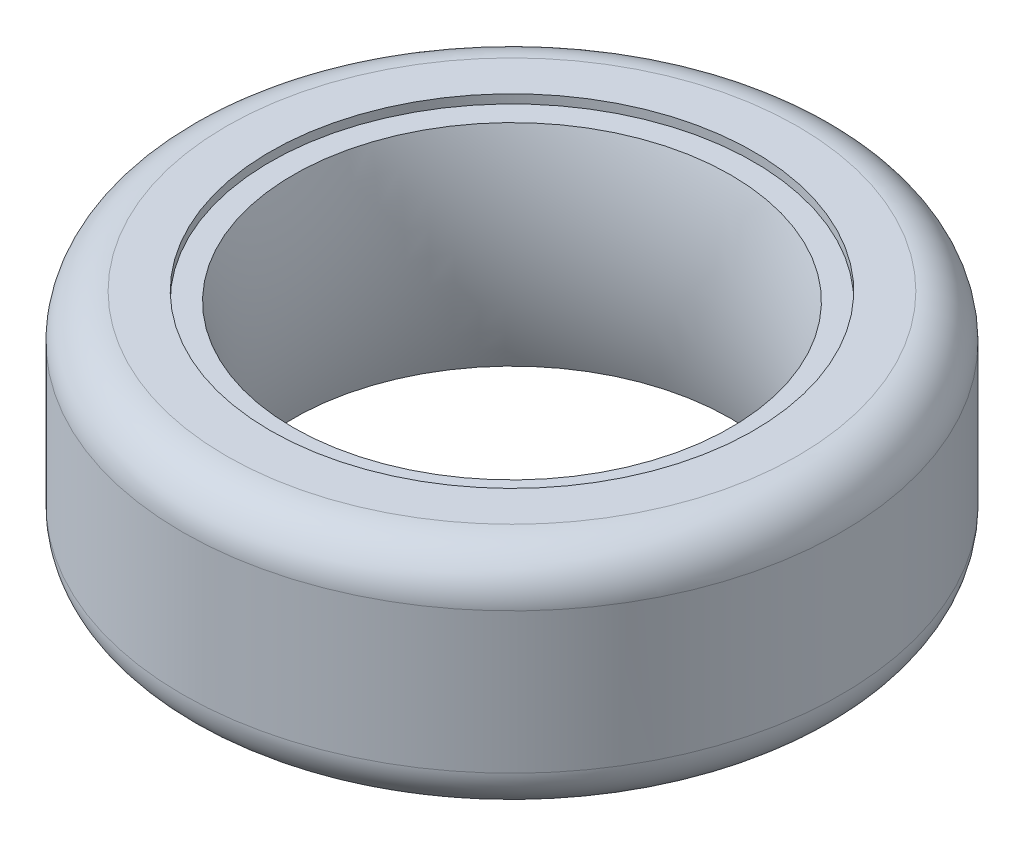
ISO-10303-21;
HEADER;
FILE_DESCRIPTION(('STEP AP214'),'2;1');
FILE_NAME('part.step','',(''),(''),'','','');
FILE_SCHEMA(('AUTOMOTIVE_DESIGN { 1 0 10303 214 1 1 1 1 }'));
ENDSEC;
DATA;
#1=APPLICATION_CONTEXT('core data for automotive mechanical design processes');
#2=APPLICATION_PROTOCOL_DEFINITION('international standard','automotive_design',2000,#1);
#3=PRODUCT_CONTEXT('',#1,'mechanical');
#4=PRODUCT('Part','Part','',(#3));
#5=PRODUCT_RELATED_PRODUCT_CATEGORY('part','',(#4));
#6=PRODUCT_DEFINITION_FORMATION('','',#4);
#7=PRODUCT_DEFINITION_CONTEXT('part definition',#1,'design');
#8=PRODUCT_DEFINITION('design','',#6,#7);
#9=PRODUCT_DEFINITION_SHAPE('','',#8);
#10=(LENGTH_UNIT() NAMED_UNIT(*) SI_UNIT(.MILLI.,.METRE.));
#11=(NAMED_UNIT(*) PLANE_ANGLE_UNIT() SI_UNIT($,.RADIAN.));
#12=(NAMED_UNIT(*) SI_UNIT($,.STERADIAN.) SOLID_ANGLE_UNIT());
#13=UNCERTAINTY_MEASURE_WITH_UNIT(LENGTH_MEASURE(1.E-05),#10,'distance_accuracy_value','');
#14=(GEOMETRIC_REPRESENTATION_CONTEXT(3) GLOBAL_UNCERTAINTY_ASSIGNED_CONTEXT((#13)) GLOBAL_UNIT_ASSIGNED_CONTEXT((#10,
#11,#12)) REPRESENTATION_CONTEXT('',''));
#15=CARTESIAN_POINT('',(0.,0.,0.));
#16=DIRECTION('',(0.,0.,1.));
#17=DIRECTION('',(1.,0.,0.));
#18=AXIS2_PLACEMENT_3D('',#15,#16,#17);
#19=CARTESIAN_POINT('',(0.,0.,0.));
#20=DIRECTION('',(0.,1.,0.));
#21=DIRECTION('',(0.,0.,1.));
#22=AXIS2_PLACEMENT_3D('',#19,#20,#21);
#23=TOROIDAL_SURFACE('',#22,63.0575680566778,40.);
#24=CARTESIAN_POINT('',(0.,-12.,0.));
#25=DIRECTION('',(0.,1.,0.));
#26=DIRECTION('',(0.,0.,1.));
#27=AXIS2_PLACEMENT_3D('',#24,#25,#26);
#28=CIRCLE('',#27,24.9);
#29=CARTESIAN_POINT('',(0.,-12.,24.9));
#30=VERTEX_POINT('',#29);
#31=EDGE_CURVE('E79',#30,#30,#28,.T.);
#32=ORIENTED_EDGE('',*,*,#31,.F.);
#33=EDGE_LOOP('',(#32));
#34=FACE_BOUND('',#33,.T.);
#35=CARTESIAN_POINT('',(0.,12.,0.));
#36=DIRECTION('',(0.,1.,0.));
#37=DIRECTION('',(0.,0.,1.));
#38=AXIS2_PLACEMENT_3D('',#35,#36,#37);
#39=CIRCLE('',#38,24.9);
#40=CARTESIAN_POINT('',(0.,12.,24.9));
#41=VERTEX_POINT('',#40);
#42=EDGE_CURVE('E64',#41,#41,#39,.T.);
#43=ORIENTED_EDGE('',*,*,#42,.T.);
#44=EDGE_LOOP('',(#43));
#45=FACE_BOUND('',#44,.T.);
#46=ADVANCED_FACE('F44',(#34,#45),#23,.T.);
#47=CARTESIAN_POINT('',(0.,12.,0.));
#48=DIRECTION('',(0.,-1.,0.));
#49=DIRECTION('',(0.,0.,-1.));
#50=AXIS2_PLACEMENT_3D('',#47,#48,#49);
#51=PLANE('',#50);
#52=ORIENTED_EDGE('',*,*,#42,.F.);
#53=EDGE_LOOP('',(#52));
#54=FACE_BOUND('',#53,.T.);
#55=CARTESIAN_POINT('',(0.,12.,0.));
#56=DIRECTION('',(0.,1.,0.));
#57=DIRECTION('',(0.,0.,1.));
#58=AXIS2_PLACEMENT_3D('',#55,#56,#57);
#59=CIRCLE('',#58,27.5);
#60=CARTESIAN_POINT('',(0.,12.,27.5));
#61=VERTEX_POINT('',#60);
#62=EDGE_CURVE('E67',#61,#61,#59,.T.);
#63=ORIENTED_EDGE('',*,*,#62,.T.);
#64=EDGE_LOOP('',(#63));
#65=FACE_BOUND('',#64,.T.);
#66=ADVANCED_FACE('F87',(#54,#65),#51,.F.);
#67=CARTESIAN_POINT('',(0.,39.1439042874109,0.));
#68=DIRECTION('',(0.,1.,0.));
#69=DIRECTION('',(0.,0.,1.));
#70=AXIS2_PLACEMENT_3D('',#67,#68,#69);
#71=CYLINDRICAL_SURFACE('',#70,27.5);
#72=CARTESIAN_POINT('',(0.,13.,0.));
#73=DIRECTION('',(0.,1.,0.));
#74=DIRECTION('',(0.,0.,1.));
#75=AXIS2_PLACEMENT_3D('',#72,#73,#74);
#76=CIRCLE('',#75,27.5);
#77=CARTESIAN_POINT('',(0.,13.,27.5));
#78=VERTEX_POINT('',#77);
#79=EDGE_CURVE('E70',#78,#78,#76,.T.);
#80=ORIENTED_EDGE('',*,*,#79,.T.);
#81=EDGE_LOOP('',(#80));
#82=FACE_BOUND('',#81,.T.);
#83=ORIENTED_EDGE('',*,*,#62,.F.);
#84=EDGE_LOOP('',(#83));
#85=FACE_BOUND('',#84,.T.);
#86=ADVANCED_FACE('F93',(#82,#85),#71,.F.);
#87=CARTESIAN_POINT('',(0.,13.,0.));
#88=DIRECTION('',(0.,1.,0.));
#89=DIRECTION('',(0.,0.,1.));
#90=AXIS2_PLACEMENT_3D('',#87,#88,#89);
#91=PLANE('',#90);
#92=CARTESIAN_POINT('',(0.,13.,0.));
#93=DIRECTION('',(0.,1.,0.));
#94=DIRECTION('',(0.,0.,1.));
#95=AXIS2_PLACEMENT_3D('',#92,#93,#94);
#96=CIRCLE('',#95,32.5);
#97=CARTESIAN_POINT('',(0.,13.,32.5));
#98=VERTEX_POINT('',#97);
#99=EDGE_CURVE('E59',#98,#98,#96,.T.);
#100=ORIENTED_EDGE('',*,*,#99,.T.);
#101=EDGE_LOOP('',(#100));
#102=FACE_BOUND('',#101,.T.);
#103=ORIENTED_EDGE('',*,*,#79,.F.);
#104=EDGE_LOOP('',(#103));
#105=FACE_BOUND('',#104,.T.);
#106=ADVANCED_FACE('F98',(#102,#105),#91,.T.);
#107=CARTESIAN_POINT('',(0.,39.1439042874109,0.));
#108=DIRECTION('',(0.,1.,0.));
#109=DIRECTION('',(0.,0.,1.));
#110=AXIS2_PLACEMENT_3D('',#107,#108,#109);
#111=CYLINDRICAL_SURFACE('',#110,37.5);
#112=CARTESIAN_POINT('',(0.,8.00000000000001,0.));
#113=DIRECTION('',(0.,1.,0.));
#114=DIRECTION('',(0.,0.,1.));
#115=AXIS2_PLACEMENT_3D('',#112,#113,#114);
#116=CIRCLE('',#115,37.5);
#117=CARTESIAN_POINT('',(0.,8.00000000000001,37.5));
#118=VERTEX_POINT('',#117);
#119=EDGE_CURVE('E51',#118,#118,#116,.F.);
#120=ORIENTED_EDGE('',*,*,#119,.T.);
#121=EDGE_LOOP('',(#120));
#122=FACE_BOUND('',#121,.T.);
#123=CARTESIAN_POINT('',(0.,-7.99999999999998,0.));
#124=DIRECTION('',(0.,-1.,0.));
#125=DIRECTION('',(0.,0.,-1.));
#126=AXIS2_PLACEMENT_3D('',#123,#124,#125);
#127=CIRCLE('',#126,37.5);
#128=CARTESIAN_POINT('',(0.,-7.99999999999998,-37.5));
#129=VERTEX_POINT('',#128);
#130=EDGE_CURVE('E55',#129,#129,#127,.F.);
#131=ORIENTED_EDGE('',*,*,#130,.T.);
#132=EDGE_LOOP('',(#131));
#133=FACE_BOUND('',#132,.T.);
#134=ADVANCED_FACE('F104',(#122,#133),#111,.T.);
#135=CARTESIAN_POINT('',(0.,-13.,0.));
#136=DIRECTION('',(0.,-1.,0.));
#137=DIRECTION('',(0.,0.,-1.));
#138=AXIS2_PLACEMENT_3D('',#135,#136,#137);
#139=PLANE('',#138);
#140=CARTESIAN_POINT('',(0.,-13.,0.));
#141=DIRECTION('',(0.,-1.,0.));
#142=DIRECTION('',(0.,0.,-1.));
#143=AXIS2_PLACEMENT_3D('',#140,#141,#142);
#144=CIRCLE('',#143,32.5);
#145=CARTESIAN_POINT('',(0.,-13.,-32.5));
#146=VERTEX_POINT('',#145);
#147=EDGE_CURVE('E12',#146,#146,#144,.T.);
#148=ORIENTED_EDGE('',*,*,#147,.T.);
#149=EDGE_LOOP('',(#148));
#150=FACE_BOUND('',#149,.T.);
#151=CARTESIAN_POINT('',(0.,-13.,0.));
#152=DIRECTION('',(0.,1.,0.));
#153=DIRECTION('',(0.,0.,1.));
#154=AXIS2_PLACEMENT_3D('',#151,#152,#153);
#155=CIRCLE('',#154,27.5);
#156=CARTESIAN_POINT('',(0.,-13.,27.5));
#157=VERTEX_POINT('',#156);
#158=EDGE_CURVE('E73',#157,#157,#155,.T.);
#159=ORIENTED_EDGE('',*,*,#158,.T.);
#160=EDGE_LOOP('',(#159));
#161=FACE_BOUND('',#160,.T.);
#162=ADVANCED_FACE('F126',(#150,#161),#139,.T.);
#163=CARTESIAN_POINT('',(0.,39.1439042874109,0.));
#164=DIRECTION('',(0.,1.,0.));
#165=DIRECTION('',(0.,0.,1.));
#166=AXIS2_PLACEMENT_3D('',#163,#164,#165);
#167=CYLINDRICAL_SURFACE('',#166,27.5);
#168=CARTESIAN_POINT('',(0.,-12.,0.));
#169=DIRECTION('',(0.,1.,0.));
#170=DIRECTION('',(0.,0.,1.));
#171=AXIS2_PLACEMENT_3D('',#168,#169,#170);
#172=CIRCLE('',#171,27.5);
#173=CARTESIAN_POINT('',(0.,-12.,27.5));
#174=VERTEX_POINT('',#173);
#175=EDGE_CURVE('E76',#174,#174,#172,.T.);
#176=ORIENTED_EDGE('',*,*,#175,.T.);
#177=EDGE_LOOP('',(#176));
#178=FACE_BOUND('',#177,.T.);
#179=ORIENTED_EDGE('',*,*,#158,.F.);
#180=EDGE_LOOP('',(#179));
#181=FACE_BOUND('',#180,.T.);
#182=ADVANCED_FACE('F116',(#178,#181),#167,.F.);
#183=CARTESIAN_POINT('',(0.,-12.,0.));
#184=DIRECTION('',(0.,1.,0.));
#185=DIRECTION('',(0.,0.,1.));
#186=AXIS2_PLACEMENT_3D('',#183,#184,#185);
#187=PLANE('',#186);
#188=ORIENTED_EDGE('',*,*,#175,.F.);
#189=EDGE_LOOP('',(#188));
#190=FACE_BOUND('',#189,.T.);
#191=ORIENTED_EDGE('',*,*,#31,.T.);
#192=EDGE_LOOP('',(#191));
#193=FACE_BOUND('',#192,.T.);
#194=ADVANCED_FACE('F83',(#190,#193),#187,.F.);
#195=CARTESIAN_POINT('',(0.,8.00000000000001,0.));
#196=DIRECTION('',(0.,1.,0.));
#197=DIRECTION('',(0.,0.,1.));
#198=AXIS2_PLACEMENT_3D('',#195,#196,#197);
#199=TOROIDAL_SURFACE('',#198,32.5,5.);
#200=ORIENTED_EDGE('',*,*,#119,.F.);
#201=EDGE_LOOP('',(#200));
#202=FACE_BOUND('',#201,.T.);
#203=ORIENTED_EDGE('',*,*,#99,.F.);
#204=EDGE_LOOP('',(#203));
#205=FACE_BOUND('',#204,.T.);
#206=ADVANCED_FACE('F108',(#202,#205),#199,.T.);
#207=CARTESIAN_POINT('',(0.,-7.99999999999998,0.));
#208=DIRECTION('',(0.,-1.,0.));
#209=DIRECTION('',(0.,0.,-1.));
#210=AXIS2_PLACEMENT_3D('',#207,#208,#209);
#211=TOROIDAL_SURFACE('',#210,32.5,5.);
#212=ORIENTED_EDGE('',*,*,#147,.F.);
#213=EDGE_LOOP('',(#212));
#214=FACE_BOUND('',#213,.T.);
#215=ORIENTED_EDGE('',*,*,#130,.F.);
#216=EDGE_LOOP('',(#215));
#217=FACE_BOUND('',#216,.T.);
#218=ADVANCED_FACE('F46',(#214,#217),#211,.T.);
#219=CLOSED_SHELL('',(#46,#66,#86,#106,#134,#162,#182,#194,#206,#218));
#220=MANIFOLD_SOLID_BREP('B2',#219);
#221=ADVANCED_BREP_SHAPE_REPRESENTATION('',(#18,#220),#14);
#222=SHAPE_DEFINITION_REPRESENTATION(#9,#221);
ENDSEC;
END-ISO-10303-21;
